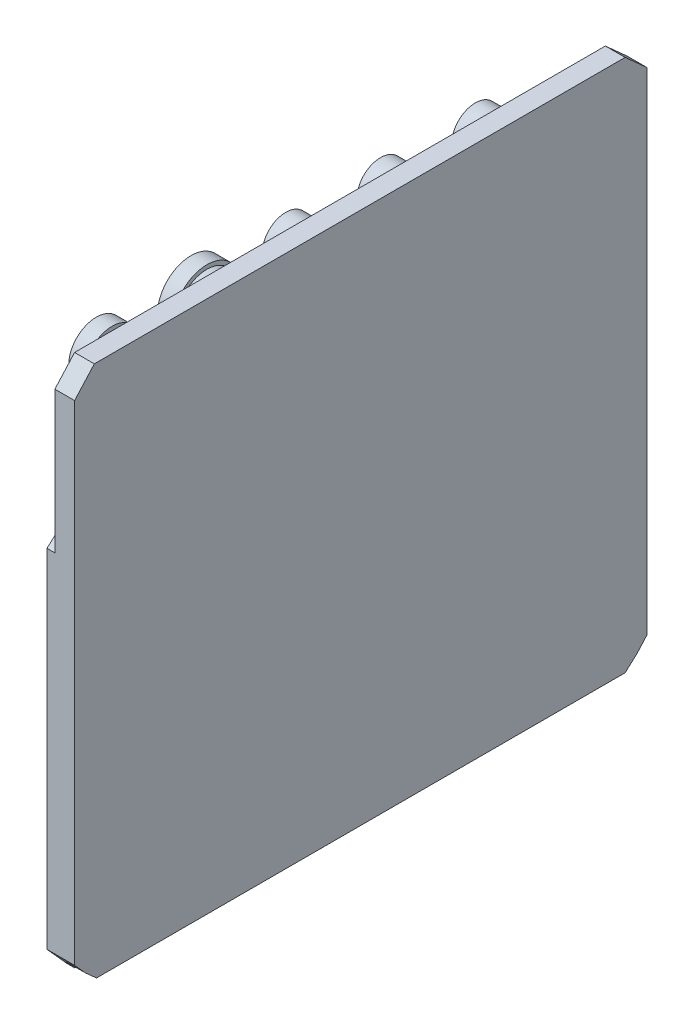
ISO-10303-21;
HEADER;
FILE_DESCRIPTION(('STEP AP214'),'2;1');
FILE_NAME('part.step','',(''),(''),'','','');
FILE_SCHEMA(('AUTOMOTIVE_DESIGN { 1 0 10303 214 1 1 1 1 }'));
ENDSEC;
DATA;
#1=APPLICATION_CONTEXT('core data for automotive mechanical design processes');
#2=APPLICATION_PROTOCOL_DEFINITION('international standard','automotive_design',2000,#1);
#3=PRODUCT_CONTEXT('',#1,'mechanical');
#4=PRODUCT('Part','Part','',(#3));
#5=PRODUCT_RELATED_PRODUCT_CATEGORY('part','',(#4));
#6=PRODUCT_DEFINITION_FORMATION('','',#4);
#7=PRODUCT_DEFINITION_CONTEXT('part definition',#1,'design');
#8=PRODUCT_DEFINITION('design','',#6,#7);
#9=PRODUCT_DEFINITION_SHAPE('','',#8);
#10=(LENGTH_UNIT() NAMED_UNIT(*) SI_UNIT(.MILLI.,.METRE.));
#11=(NAMED_UNIT(*) PLANE_ANGLE_UNIT() SI_UNIT($,.RADIAN.));
#12=(NAMED_UNIT(*) SI_UNIT($,.STERADIAN.) SOLID_ANGLE_UNIT());
#13=UNCERTAINTY_MEASURE_WITH_UNIT(LENGTH_MEASURE(1.E-05),#10,'distance_accuracy_value','');
#14=(GEOMETRIC_REPRESENTATION_CONTEXT(3) GLOBAL_UNCERTAINTY_ASSIGNED_CONTEXT((#13)) GLOBAL_UNIT_ASSIGNED_CONTEXT((#10,
#11,#12)) REPRESENTATION_CONTEXT('',''));
#15=CARTESIAN_POINT('',(0.,0.,0.));
#16=DIRECTION('',(0.,0.,1.));
#17=DIRECTION('',(1.,0.,0.));
#18=AXIS2_PLACEMENT_3D('',#15,#16,#17);
#19=CARTESIAN_POINT('',(0.,135.,0.));
#20=DIRECTION('',(-1.,0.,0.));
#21=DIRECTION('',(0.,0.,1.));
#22=AXIS2_PLACEMENT_3D('',#19,#20,#21);
#23=PLANE('',#22);
#24=CARTESIAN_POINT('',(0.,119.,-48.5));
#25=DIRECTION('',(-1.,0.,0.));
#26=DIRECTION('',(0.,0.,1.));
#27=AXIS2_PLACEMENT_3D('',#24,#25,#26);
#28=CIRCLE('',#27,7.5);
#29=CARTESIAN_POINT('',(0.,119.,-41.));
#30=VERTEX_POINT('',#29);
#31=EDGE_CURVE('E812',#30,#30,#28,.T.);
#32=ORIENTED_EDGE('',*,*,#31,.F.);
#33=EDGE_LOOP('',(#32));
#34=FACE_BOUND('',#33,.T.);
#35=CARTESIAN_POINT('',(0.,119.003353079087,-96.5));
#36=DIRECTION('',(-1.,0.,0.));
#37=DIRECTION('',(0.,0.,1.));
#38=AXIS2_PLACEMENT_3D('',#35,#36,#37);
#39=CIRCLE('',#38,5.00000000000001);
#40=CARTESIAN_POINT('',(0.,119.003353079087,-91.5));
#41=VERTEX_POINT('',#40);
#42=EDGE_CURVE('E824',#41,#41,#39,.T.);
#43=ORIENTED_EDGE('',*,*,#42,.F.);
#44=EDGE_LOOP('',(#43));
#45=FACE_BOUND('',#44,.T.);
#46=DIRECTION('',(0.,0.,-1.));
#47=VECTOR('',#46,1.);
#48=CARTESIAN_POINT('',(0.,98.5428750887542,-145.));
#49=LINE('',#48,#47);
#50=CARTESIAN_POINT('',(0.,98.5428750887542,-5.55306257414598));
#51=VERTEX_POINT('',#50);
#52=CARTESIAN_POINT('',(0.,98.5428750887542,-140.));
#53=VERTEX_POINT('',#52);
#54=EDGE_CURVE('E176',#51,#53,#49,.T.);
#55=ORIENTED_EDGE('',*,*,#54,.F.);
#56=DIRECTION('',(0.,0.66913060635886,-0.743144825477393));
#57=VECTOR('',#56,1.);
#58=CARTESIAN_POINT('',(0.,98.5428750887542,-5.55306257414598));
#59=LINE('',#58,#57);
#60=CARTESIAN_POINT('',(0.,93.5428750887541,0.));
#61=VERTEX_POINT('',#60);
#62=EDGE_CURVE('E55',#51,#61,#59,.F.);
#63=ORIENTED_EDGE('',*,*,#62,.T.);
#64=DIRECTION('',(0.,-1.,0.));
#65=VECTOR('',#64,1.);
#66=CARTESIAN_POINT('',(0.,0.,0.));
#67=LINE('',#66,#65);
#68=CARTESIAN_POINT('',(0.,129.446937425854,0.));
#69=VERTEX_POINT('',#68);
#70=EDGE_CURVE('E936',#69,#61,#67,.T.);
#71=ORIENTED_EDGE('',*,*,#70,.F.);
#72=DIRECTION('',(0.,-0.743144825477391,0.669130606358862));
#73=VECTOR('',#72,1.);
#74=CARTESIAN_POINT('',(0.,132.513695261579,-2.76132115816913));
#75=LINE('',#74,#73);
#76=CARTESIAN_POINT('',(0.,135.,-5.00000000000003));
#77=VERTEX_POINT('',#76);
#78=EDGE_CURVE('E171',#69,#77,#75,.F.);
#79=ORIENTED_EDGE('',*,*,#78,.T.);
#80=DIRECTION('',(0.,0.,1.));
#81=VECTOR('',#80,1.);
#82=CARTESIAN_POINT('',(0.,135.,0.));
#83=LINE('',#82,#81);
#84=CARTESIAN_POINT('',(0.,135.,-139.446937425854));
#85=VERTEX_POINT('',#84);
#86=EDGE_CURVE('E888',#85,#77,#83,.T.);
#87=ORIENTED_EDGE('',*,*,#86,.F.);
#88=DIRECTION('',(0.,0.669130606358862,0.743144825477391));
#89=VECTOR('',#88,1.);
#90=CARTESIAN_POINT('',(0.,204.341516256031,-62.4353816746751));
#91=LINE('',#90,#89);
#92=CARTESIAN_POINT('',(0.,130.,-145.));
#93=VERTEX_POINT('',#92);
#94=EDGE_CURVE('E900',#85,#93,#91,.F.);
#95=ORIENTED_EDGE('',*,*,#94,.T.);
#96=DIRECTION('',(0.,1.,0.));
#97=VECTOR('',#96,1.);
#98=CARTESIAN_POINT('',(0.,0.,-145.));
#99=LINE('',#98,#97);
#100=CARTESIAN_POINT('',(0.,92.9898125146082,-145.));
#101=VERTEX_POINT('',#100);
#102=EDGE_CURVE('E893',#101,#93,#99,.T.);
#103=ORIENTED_EDGE('',*,*,#102,.F.);
#104=DIRECTION('',(0.,-0.743144825477395,-0.669130606358858));
#105=VECTOR('',#104,1.);
#106=CARTESIAN_POINT('',(0.,92.9898125146082,-145.));
#107=LINE('',#106,#105);
#108=EDGE_CURVE('E47',#101,#53,#107,.F.);
#109=ORIENTED_EDGE('',*,*,#108,.T.);
#110=EDGE_LOOP('',(#55,#63,#71,#79,#87,#95,#103,#109));
#111=FACE_BOUND('',#110,.T.);
#112=CARTESIAN_POINT('',(0.,119.,-120.5));
#113=DIRECTION('',(-1.,0.,0.));
#114=DIRECTION('',(0.,0.,1.));
#115=AXIS2_PLACEMENT_3D('',#112,#113,#114);
#116=CIRCLE('',#115,5.00000000000001);
#117=CARTESIAN_POINT('',(0.,119.,-115.5));
#118=VERTEX_POINT('',#117);
#119=EDGE_CURVE('E830',#118,#118,#116,.T.);
#120=ORIENTED_EDGE('',*,*,#119,.F.);
#121=EDGE_LOOP('',(#120));
#122=FACE_BOUND('',#121,.T.);
#123=CARTESIAN_POINT('',(0.,119.,-72.5));
#124=DIRECTION('',(-1.,0.,0.));
#125=DIRECTION('',(0.,0.,1.));
#126=AXIS2_PLACEMENT_3D('',#123,#124,#125);
#127=CIRCLE('',#126,5.00000000000001);
#128=CARTESIAN_POINT('',(0.,119.,-67.5));
#129=VERTEX_POINT('',#128);
#130=EDGE_CURVE('E818',#129,#129,#127,.T.);
#131=ORIENTED_EDGE('',*,*,#130,.F.);
#132=EDGE_LOOP('',(#131));
#133=FACE_BOUND('',#132,.T.);
#134=CARTESIAN_POINT('',(0.,119.003353079087,-24.5));
#135=DIRECTION('',(-1.,0.,0.));
#136=DIRECTION('',(0.,0.,1.));
#137=AXIS2_PLACEMENT_3D('',#134,#135,#136);
#138=CIRCLE('',#137,6.);
#139=CARTESIAN_POINT('',(0.,119.003353079087,-18.5));
#140=VERTEX_POINT('',#139);
#141=EDGE_CURVE('E806',#140,#140,#138,.T.);
#142=ORIENTED_EDGE('',*,*,#141,.F.);
#143=EDGE_LOOP('',(#142));
#144=FACE_BOUND('',#143,.T.);
#145=ADVANCED_FACE('F32',(#34,#45,#111,#122,#133,#144),#23,.T.);
#146=CARTESIAN_POINT('',(5.,0.,0.));
#147=DIRECTION('',(0.,0.,-1.));
#148=DIRECTION('',(-1.,0.,0.));
#149=AXIS2_PLACEMENT_3D('',#146,#147,#148);
#150=PLANE('',#149);
#151=DIRECTION('',(0.,1.,0.));
#152=VECTOR('',#151,1.);
#153=CARTESIAN_POINT('',(-2.,98.5428750887542,0.));
#154=LINE('',#153,#152);
#155=CARTESIAN_POINT('',(-2.,5.55306257414596,0.));
#156=VERTEX_POINT('',#155);
#157=CARTESIAN_POINT('',(-2.,93.5428750887541,0.));
#158=VERTEX_POINT('',#157);
#159=EDGE_CURVE('E882',#156,#158,#154,.T.);
#160=ORIENTED_EDGE('',*,*,#159,.F.);
#161=DIRECTION('',(1.,0.,0.));
#162=VECTOR('',#161,1.);
#163=CARTESIAN_POINT('',(5.,5.55306257414598,0.));
#164=LINE('',#163,#162);
#165=CARTESIAN_POINT('',(5.,5.55306257414598,0.));
#166=VERTEX_POINT('',#165);
#167=EDGE_CURVE('E872',#156,#166,#164,.T.);
#168=ORIENTED_EDGE('',*,*,#167,.T.);
#169=DIRECTION('',(0.,-1.,0.));
#170=VECTOR('',#169,1.);
#171=CARTESIAN_POINT('',(5.,0.,0.));
#172=LINE('',#171,#170);
#173=CARTESIAN_POINT('',(5.,129.446937425854,0.));
#174=VERTEX_POINT('',#173);
#175=EDGE_CURVE('E879',#174,#166,#172,.T.);
#176=ORIENTED_EDGE('',*,*,#175,.F.);
#177=DIRECTION('',(-1.,0.,0.));
#178=VECTOR('',#177,1.);
#179=CARTESIAN_POINT('',(5.,129.446937425854,0.));
#180=LINE('',#179,#178);
#181=EDGE_CURVE('E158',#174,#69,#180,.T.);
#182=ORIENTED_EDGE('',*,*,#181,.T.);
#183=ORIENTED_EDGE('',*,*,#70,.T.);
#184=DIRECTION('',(-1.,0.,0.));
#185=VECTOR('',#184,1.);
#186=CARTESIAN_POINT('',(5.,93.5428750887541,0.));
#187=LINE('',#186,#185);
#188=EDGE_CURVE('E870',#61,#158,#187,.T.);
#189=ORIENTED_EDGE('',*,*,#188,.T.);
#190=EDGE_LOOP('',(#160,#168,#176,#182,#183,#189));
#191=FACE_BOUND('',#190,.T.);
#192=ADVANCED_FACE('F34',(#191),#150,.F.);
#193=CARTESIAN_POINT('',(5.,0.,0.));
#194=DIRECTION('',(0.,1.,0.));
#195=DIRECTION('',(0.,0.,1.));
#196=AXIS2_PLACEMENT_3D('',#193,#194,#195);
#197=PLANE('',#196);
#198=DIRECTION('',(0.,0.,1.));
#199=VECTOR('',#198,1.);
#200=CARTESIAN_POINT('',(-2.,0.,-145.));
#201=LINE('',#200,#199);
#202=CARTESIAN_POINT('',(-2.,0.,-139.446937425854));
#203=VERTEX_POINT('',#202);
#204=CARTESIAN_POINT('',(-2.,0.,-5.00000000000003));
#205=VERTEX_POINT('',#204);
#206=EDGE_CURVE('E932',#203,#205,#201,.T.);
#207=ORIENTED_EDGE('',*,*,#206,.F.);
#208=DIRECTION('',(1.,0.,0.));
#209=VECTOR('',#208,1.);
#210=CARTESIAN_POINT('',(5.,0.,-139.446937425854));
#211=LINE('',#210,#209);
#212=CARTESIAN_POINT('',(5.,0.,-139.446937425854));
#213=VERTEX_POINT('',#212);
#214=EDGE_CURVE('E921',#203,#213,#211,.T.);
#215=ORIENTED_EDGE('',*,*,#214,.T.);
#216=DIRECTION('',(0.,0.,-1.));
#217=VECTOR('',#216,1.);
#218=CARTESIAN_POINT('',(5.,0.,0.));
#219=LINE('',#218,#217);
#220=CARTESIAN_POINT('',(5.,0.,-5.55306257414598));
#221=VERTEX_POINT('',#220);
#222=EDGE_CURVE('E170',#221,#213,#219,.T.);
#223=ORIENTED_EDGE('',*,*,#222,.F.);
#224=DIRECTION('',(-1.,0.,0.));
#225=VECTOR('',#224,1.);
#226=CARTESIAN_POINT('',(5.,0.,-5.55306257414598));
#227=LINE('',#226,#225);
#228=CARTESIAN_POINT('',(0.,0.,-5.55306257414597));
#229=VERTEX_POINT('',#228);
#230=EDGE_CURVE('E152',#221,#229,#227,.T.);
#231=ORIENTED_EDGE('',*,*,#230,.T.);
#232=DIRECTION('',(0.,0.,1.));
#233=VECTOR('',#232,1.);
#234=CARTESIAN_POINT('',(0.,0.,-145.));
#235=LINE('',#234,#233);
#236=CARTESIAN_POINT('',(0.,0.,-5.00000000000003));
#237=VERTEX_POINT('',#236);
#238=EDGE_CURVE('E166',#229,#237,#235,.T.);
#239=ORIENTED_EDGE('',*,*,#238,.T.);
#240=DIRECTION('',(-1.,0.,0.));
#241=VECTOR('',#240,1.);
#242=CARTESIAN_POINT('',(5.,0.,-5.00000000000003));
#243=LINE('',#242,#241);
#244=EDGE_CURVE('E919',#237,#205,#243,.T.);
#245=ORIENTED_EDGE('',*,*,#244,.T.);
#246=EDGE_LOOP('',(#207,#215,#223,#231,#239,#245));
#247=FACE_BOUND('',#246,.T.);
#248=ADVANCED_FACE('F165',(#247),#197,.F.);
#249=CARTESIAN_POINT('',(5.,0.,-145.));
#250=DIRECTION('',(0.,0.,1.));
#251=DIRECTION('',(1.,0.,0.));
#252=AXIS2_PLACEMENT_3D('',#249,#250,#251);
#253=PLANE('',#252);
#254=DIRECTION('',(0.,-1.,0.));
#255=VECTOR('',#254,1.);
#256=CARTESIAN_POINT('',(0.,98.5428750887542,-145.));
#257=LINE('',#256,#255);
#258=CARTESIAN_POINT('',(0.,5.553062574146,-145.));
#259=VERTEX_POINT('',#258);
#260=CARTESIAN_POINT('',(0.,5.00000000000009,-145.));
#261=VERTEX_POINT('',#260);
#262=EDGE_CURVE('E177',#259,#261,#257,.T.);
#263=ORIENTED_EDGE('',*,*,#262,.T.);
#264=DIRECTION('',(-1.,0.,0.));
#265=VECTOR('',#264,1.);
#266=CARTESIAN_POINT('',(5.,5.00000000000006,-145.));
#267=LINE('',#266,#265);
#268=CARTESIAN_POINT('',(-2.,5.00000000000004,-145.));
#269=VERTEX_POINT('',#268);
#270=EDGE_CURVE('E860',#261,#269,#267,.T.);
#271=ORIENTED_EDGE('',*,*,#270,.T.);
#272=DIRECTION('',(0.,-1.,0.));
#273=VECTOR('',#272,1.);
#274=CARTESIAN_POINT('',(-2.,98.5428750887542,-145.));
#275=LINE('',#274,#273);
#276=CARTESIAN_POINT('',(-2.,92.9898125146082,-145.));
#277=VERTEX_POINT('',#276);
#278=EDGE_CURVE('E179',#277,#269,#275,.T.);
#279=ORIENTED_EDGE('',*,*,#278,.F.);
#280=DIRECTION('',(1.,0.,0.));
#281=VECTOR('',#280,1.);
#282=CARTESIAN_POINT('',(5.,92.9898125146082,-145.));
#283=LINE('',#282,#281);
#284=EDGE_CURVE('E856',#277,#101,#283,.T.);
#285=ORIENTED_EDGE('',*,*,#284,.T.);
#286=ORIENTED_EDGE('',*,*,#102,.T.);
#287=DIRECTION('',(1.,0.,0.));
#288=VECTOR('',#287,1.);
#289=CARTESIAN_POINT('',(5.,130.,-145.));
#290=LINE('',#289,#288);
#291=CARTESIAN_POINT('',(5.,130.,-145.));
#292=VERTEX_POINT('',#291);
#293=EDGE_CURVE('E916',#93,#292,#290,.T.);
#294=ORIENTED_EDGE('',*,*,#293,.T.);
#295=DIRECTION('',(0.,1.,0.));
#296=VECTOR('',#295,1.);
#297=CARTESIAN_POINT('',(5.,0.,-145.));
#298=LINE('',#297,#296);
#299=CARTESIAN_POINT('',(5.,5.55306257414598,-145.));
#300=VERTEX_POINT('',#299);
#301=EDGE_CURVE('E890',#300,#292,#298,.T.);
#302=ORIENTED_EDGE('',*,*,#301,.F.);
#303=DIRECTION('',(-1.,0.,0.));
#304=VECTOR('',#303,1.);
#305=CARTESIAN_POINT('',(5.,5.55306257414598,-145.));
#306=LINE('',#305,#304);
#307=EDGE_CURVE('E912',#300,#259,#306,.T.);
#308=ORIENTED_EDGE('',*,*,#307,.T.);
#309=EDGE_LOOP('',(#263,#271,#279,#285,#286,#294,#302,#308));
#310=FACE_BOUND('',#309,.T.);
#311=ADVANCED_FACE('F254',(#310),#253,.F.);
#312=CARTESIAN_POINT('',(5.,135.,0.));
#313=DIRECTION('',(0.,-1.,0.));
#314=DIRECTION('',(0.,0.,-1.));
#315=AXIS2_PLACEMENT_3D('',#312,#313,#314);
#316=PLANE('',#315);
#317=DIRECTION('',(0.,0.,1.));
#318=VECTOR('',#317,1.);
#319=CARTESIAN_POINT('',(5.,135.,0.));
#320=LINE('',#319,#318);
#321=CARTESIAN_POINT('',(5.,135.,-139.446937425854));
#322=VERTEX_POINT('',#321);
#323=CARTESIAN_POINT('',(5.,135.,-5.00000000000003));
#324=VERTEX_POINT('',#323);
#325=EDGE_CURVE('E172',#322,#324,#320,.T.);
#326=ORIENTED_EDGE('',*,*,#325,.F.);
#327=DIRECTION('',(-1.,0.,0.));
#328=VECTOR('',#327,1.);
#329=CARTESIAN_POINT('',(5.,135.,-139.446937425854));
#330=LINE('',#329,#328);
#331=EDGE_CURVE('E922',#322,#85,#330,.T.);
#332=ORIENTED_EDGE('',*,*,#331,.T.);
#333=ORIENTED_EDGE('',*,*,#86,.T.);
#334=DIRECTION('',(1.,0.,0.));
#335=VECTOR('',#334,1.);
#336=CARTESIAN_POINT('',(5.,135.,-5.00000000000003));
#337=LINE('',#336,#335);
#338=EDGE_CURVE('E915',#77,#324,#337,.T.);
#339=ORIENTED_EDGE('',*,*,#338,.T.);
#340=EDGE_LOOP('',(#326,#332,#333,#339));
#341=FACE_BOUND('',#340,.T.);
#342=ADVANCED_FACE('F250',(#341),#316,.F.);
#343=CARTESIAN_POINT('',(5.,135.,0.));
#344=DIRECTION('',(-1.,0.,0.));
#345=DIRECTION('',(0.,0.,1.));
#346=AXIS2_PLACEMENT_3D('',#343,#344,#345);
#347=PLANE('',#346);
#348=ORIENTED_EDGE('',*,*,#222,.T.);
#349=DIRECTION('',(0.,-0.669130606358864,0.743144825477389));
#350=VECTOR('',#349,1.);
#351=CARTESIAN_POINT('',(5.,0.,-139.446937425854));
#352=LINE('',#351,#350);
#353=CARTESIAN_POINT('',(5.,2.63101944820765,-142.368980551792));
#354=VERTEX_POINT('',#353);
#355=EDGE_CURVE('E925',#213,#354,#352,.F.);
#356=ORIENTED_EDGE('',*,*,#355,.T.);
#357=DIRECTION('',(0.,-0.743144825477395,0.669130606358858));
#358=VECTOR('',#357,1.);
#359=CARTESIAN_POINT('',(5.,5.55306257414598,-145.));
#360=LINE('',#359,#358);
#361=EDGE_CURVE('E947',#354,#300,#360,.F.);
#362=ORIENTED_EDGE('',*,*,#361,.T.);
#363=ORIENTED_EDGE('',*,*,#301,.T.);
#364=DIRECTION('',(0.,-0.669130606358862,-0.743144825477391));
#365=VECTOR('',#364,1.);
#366=CARTESIAN_POINT('',(5.,135.,-139.446937425854));
#367=LINE('',#366,#365);
#368=EDGE_CURVE('E949',#292,#322,#367,.F.);
#369=ORIENTED_EDGE('',*,*,#368,.T.);
#370=ORIENTED_EDGE('',*,*,#325,.T.);
#371=DIRECTION('',(0.,0.743144825477391,-0.669130606358862));
#372=VECTOR('',#371,1.);
#373=CARTESIAN_POINT('',(5.,129.446937425854,0.));
#374=LINE('',#373,#372);
#375=EDGE_CURVE('E887',#324,#174,#374,.F.);
#376=ORIENTED_EDGE('',*,*,#375,.T.);
#377=ORIENTED_EDGE('',*,*,#175,.T.);
#378=DIRECTION('',(0.,0.743144825477393,0.66913060635886));
#379=VECTOR('',#378,1.);
#380=CARTESIAN_POINT('',(5.,5.55306257414598,0.));
#381=LINE('',#380,#379);
#382=CARTESIAN_POINT('',(5.,2.63101944820752,-2.6310194482077));
#383=VERTEX_POINT('',#382);
#384=EDGE_CURVE('E884',#166,#383,#381,.F.);
#385=ORIENTED_EDGE('',*,*,#384,.T.);
#386=DIRECTION('',(0.,0.669130606358858,0.743144825477395));
#387=VECTOR('',#386,1.);
#388=CARTESIAN_POINT('',(5.,0.,-5.55306257414598));
#389=LINE('',#388,#387);
#390=EDGE_CURVE('E945',#383,#221,#389,.F.);
#391=ORIENTED_EDGE('',*,*,#390,.T.);
#392=EDGE_LOOP('',(#348,#356,#362,#363,#369,#370,#376,#377,#385,#391));
#393=FACE_BOUND('',#392,.T.);
#394=ADVANCED_FACE('F247',(#393),#347,.F.);
#395=CARTESIAN_POINT('',(5.,0.,-5.55306257414598));
#396=DIRECTION('',(0.,0.743144825477395,-0.669130606358858));
#397=DIRECTION('',(0.,0.669130606358858,0.743144825477395));
#398=AXIS2_PLACEMENT_3D('',#395,#396,#397);
#399=PLANE('',#398);
#400=ORIENTED_EDGE('',*,*,#390,.F.);
#401=DIRECTION('',(-1.,0.,0.));
#402=VECTOR('',#401,1.);
#403=CARTESIAN_POINT('',(5.,2.63101944820754,-2.63101944820769));
#404=LINE('',#403,#402);
#405=CARTESIAN_POINT('',(0.,2.63101944820713,-2.63101944820809));
#406=VERTEX_POINT('',#405);
#407=EDGE_CURVE('E154',#383,#406,#404,.T.);
#408=ORIENTED_EDGE('',*,*,#407,.T.);
#409=DIRECTION('',(0.,-0.669130606358858,-0.743144825477395));
#410=VECTOR('',#409,1.);
#411=CARTESIAN_POINT('',(0.,63.2056498876024,64.6439231989378));
#412=LINE('',#411,#410);
#413=EDGE_CURVE('E148',#229,#406,#412,.F.);
#414=ORIENTED_EDGE('',*,*,#413,.F.);
#415=ORIENTED_EDGE('',*,*,#230,.F.);
#416=EDGE_LOOP('',(#400,#408,#414,#415));
#417=FACE_BOUND('',#416,.T.);
#418=ADVANCED_FACE('F151',(#417),#399,.F.);
#419=CARTESIAN_POINT('',(5.,5.55306257414598,-145.));
#420=DIRECTION('',(0.,0.669130606358858,0.743144825477395));
#421=DIRECTION('',(0.,-0.743144825477395,0.669130606358858));
#422=AXIS2_PLACEMENT_3D('',#419,#420,#421);
#423=PLANE('',#422);
#424=ORIENTED_EDGE('',*,*,#361,.F.);
#425=DIRECTION('',(-1.,0.,0.));
#426=VECTOR('',#425,1.);
#427=CARTESIAN_POINT('',(5.,2.63101944820769,-142.368980551792));
#428=LINE('',#427,#426);
#429=CARTESIAN_POINT('',(0.,2.63101944820759,-142.368980551792));
#430=VERTEX_POINT('',#429);
#431=EDGE_CURVE('E927',#354,#430,#428,.T.);
#432=ORIENTED_EDGE('',*,*,#431,.T.);
#433=DIRECTION('',(0.,0.743144825477395,-0.669130606358858));
#434=VECTOR('',#433,1.);
#435=CARTESIAN_POINT('',(0.,4.93913859478762,-144.447220366094));
#436=LINE('',#435,#434);
#437=EDGE_CURVE('E159',#259,#430,#436,.F.);
#438=ORIENTED_EDGE('',*,*,#437,.F.);
#439=ORIENTED_EDGE('',*,*,#307,.F.);
#440=EDGE_LOOP('',(#424,#432,#438,#439));
#441=FACE_BOUND('',#440,.T.);
#442=ADVANCED_FACE('F282',(#441),#423,.F.);
#443=CARTESIAN_POINT('',(5.,135.,-139.446937425854));
#444=DIRECTION('',(0.,-0.743144825477391,0.669130606358862));
#445=DIRECTION('',(0.,-0.669130606358862,-0.743144825477391));
#446=AXIS2_PLACEMENT_3D('',#443,#444,#445);
#447=PLANE('',#446);
#448=ORIENTED_EDGE('',*,*,#368,.F.);
#449=ORIENTED_EDGE('',*,*,#293,.F.);
#450=ORIENTED_EDGE('',*,*,#94,.F.);
#451=ORIENTED_EDGE('',*,*,#331,.F.);
#452=EDGE_LOOP('',(#448,#449,#450,#451));
#453=FACE_BOUND('',#452,.T.);
#454=ADVANCED_FACE('F288',(#453),#447,.F.);
#455=CARTESIAN_POINT('',(5.,129.446937425854,0.));
#456=DIRECTION('',(0.,-0.669130606358861,-0.743144825477391));
#457=DIRECTION('',(0.,0.743144825477391,-0.669130606358862));
#458=AXIS2_PLACEMENT_3D('',#455,#456,#457);
#459=PLANE('',#458);
#460=ORIENTED_EDGE('',*,*,#375,.F.);
#461=ORIENTED_EDGE('',*,*,#338,.F.);
#462=ORIENTED_EDGE('',*,*,#78,.F.);
#463=ORIENTED_EDGE('',*,*,#181,.F.);
#464=EDGE_LOOP('',(#460,#461,#462,#463));
#465=FACE_BOUND('',#464,.T.);
#466=ADVANCED_FACE('F295',(#465),#459,.F.);
#467=CARTESIAN_POINT('',(0.,0.,-145.));
#468=DIRECTION('',(-1.,0.,0.));
#469=DIRECTION('',(0.,0.,1.));
#470=AXIS2_PLACEMENT_3D('',#467,#468,#469);
#471=PLANE('',#470);
#472=ORIENTED_EDGE('',*,*,#413,.T.);
#473=DIRECTION('',(0.,0.743144825477393,0.66913060635886));
#474=VECTOR('',#473,1.);
#475=CARTESIAN_POINT('',(0.,5.55306257414598,0.));
#476=LINE('',#475,#474);
#477=EDGE_CURVE('E175',#406,#237,#476,.F.);
#478=ORIENTED_EDGE('',*,*,#477,.T.);
#479=ORIENTED_EDGE('',*,*,#238,.F.);
#480=EDGE_LOOP('',(#472,#478,#479));
#481=FACE_BOUND('',#480,.T.);
#482=ADVANCED_FACE('F174',(#481),#471,.F.);
#483=ORIENTED_EDGE('',*,*,#437,.T.);
#484=DIRECTION('',(0.,-0.669130606358864,0.743144825477389));
#485=VECTOR('',#484,1.);
#486=CARTESIAN_POINT('',(0.,0.,-139.446937425854));
#487=LINE('',#486,#485);
#488=EDGE_CURVE('E929',#430,#261,#487,.F.);
#489=ORIENTED_EDGE('',*,*,#488,.T.);
#490=ORIENTED_EDGE('',*,*,#262,.F.);
#491=EDGE_LOOP('',(#483,#489,#490));
#492=FACE_BOUND('',#491,.T.);
#493=ADVANCED_FACE('F309',(#492),#471,.F.);
#494=CARTESIAN_POINT('',(-2.,98.5428750887542,-145.));
#495=DIRECTION('',(0.,-1.,0.));
#496=DIRECTION('',(0.,0.,-1.));
#497=AXIS2_PLACEMENT_3D('',#494,#495,#496);
#498=PLANE('',#497);
#499=DIRECTION('',(0.,0.,-1.));
#500=VECTOR('',#499,1.);
#501=CARTESIAN_POINT('',(-2.,98.5428750887542,-145.));
#502=LINE('',#501,#500);
#503=CARTESIAN_POINT('',(-2.,98.5428750887542,-5.553062574146));
#504=VERTEX_POINT('',#503);
#505=CARTESIAN_POINT('',(-2.,98.5428750887542,-140.));
#506=VERTEX_POINT('',#505);
#507=EDGE_CURVE('E934',#504,#506,#502,.T.);
#508=ORIENTED_EDGE('',*,*,#507,.F.);
#509=DIRECTION('',(1.,0.,0.));
#510=VECTOR('',#509,1.);
#511=CARTESIAN_POINT('',(-2.,98.5428750887542,-5.55306257414598));
#512=LINE('',#511,#510);
#513=EDGE_CURVE('E202',#504,#51,#512,.T.);
#514=ORIENTED_EDGE('',*,*,#513,.T.);
#515=ORIENTED_EDGE('',*,*,#54,.T.);
#516=DIRECTION('',(-1.,0.,0.));
#517=VECTOR('',#516,1.);
#518=CARTESIAN_POINT('',(-2.,98.5428750887542,-140.));
#519=LINE('',#518,#517);
#520=EDGE_CURVE('E200',#53,#506,#519,.T.);
#521=ORIENTED_EDGE('',*,*,#520,.T.);
#522=EDGE_LOOP('',(#508,#514,#515,#521));
#523=FACE_BOUND('',#522,.T.);
#524=ADVANCED_FACE('F316',(#523),#498,.F.);
#525=CARTESIAN_POINT('',(-2.,0.,-145.));
#526=DIRECTION('',(-1.,0.,0.));
#527=DIRECTION('',(0.,0.,1.));
#528=AXIS2_PLACEMENT_3D('',#525,#526,#527);
#529=PLANE('',#528);
#530=ORIENTED_EDGE('',*,*,#278,.T.);
#531=DIRECTION('',(0.,0.669130606358864,-0.743144825477389));
#532=VECTOR('',#531,1.);
#533=CARTESIAN_POINT('',(-2.,2.76132115816913,-142.513695261579));
#534=LINE('',#533,#532);
#535=EDGE_CURVE('E868',#269,#203,#534,.F.);
#536=ORIENTED_EDGE('',*,*,#535,.T.);
#537=ORIENTED_EDGE('',*,*,#206,.T.);
#538=DIRECTION('',(0.,-0.743144825477393,-0.66913060635886));
#539=VECTOR('',#538,1.);
#540=CARTESIAN_POINT('',(-2.,-69.6165326757792,-67.6830075712645));
#541=LINE('',#540,#539);
#542=EDGE_CURVE('E862',#205,#156,#541,.F.);
#543=ORIENTED_EDGE('',*,*,#542,.T.);
#544=ORIENTED_EDGE('',*,*,#159,.T.);
#545=DIRECTION('',(0.,-0.66913060635886,0.743144825477393));
#546=VECTOR('',#545,1.);
#547=CARTESIAN_POINT('',(-2.,123.763221449909,-33.5630948711719));
#548=LINE('',#547,#546);
#549=EDGE_CURVE('E859',#158,#504,#548,.F.);
#550=ORIENTED_EDGE('',*,*,#549,.T.);
#551=ORIENTED_EDGE('',*,*,#507,.T.);
#552=DIRECTION('',(0.,0.743144825477395,0.669130606358858));
#553=VECTOR('',#552,1.);
#554=CARTESIAN_POINT('',(-2.,41.6348651564544,-191.240202295984));
#555=LINE('',#554,#553);
#556=EDGE_CURVE('E855',#506,#277,#555,.F.);
#557=ORIENTED_EDGE('',*,*,#556,.T.);
#558=EDGE_LOOP('',(#530,#536,#537,#543,#544,#550,#551,#557));
#559=FACE_BOUND('',#558,.T.);
#560=ADVANCED_FACE('F323',(#559),#529,.T.);
#561=CARTESIAN_POINT('',(5.,0.,-139.446937425854));
#562=DIRECTION('',(0.,0.743144825477389,0.669130606358863));
#563=DIRECTION('',(0.,-0.669130606358864,0.743144825477389));
#564=AXIS2_PLACEMENT_3D('',#561,#562,#563);
#565=PLANE('',#564);
#566=ORIENTED_EDGE('',*,*,#535,.F.);
#567=ORIENTED_EDGE('',*,*,#270,.F.);
#568=ORIENTED_EDGE('',*,*,#488,.F.);
#569=ORIENTED_EDGE('',*,*,#431,.F.);
#570=ORIENTED_EDGE('',*,*,#355,.F.);
#571=ORIENTED_EDGE('',*,*,#214,.F.);
#572=EDGE_LOOP('',(#566,#567,#568,#569,#570,#571));
#573=FACE_BOUND('',#572,.T.);
#574=ADVANCED_FACE('F331',(#573),#565,.F.);
#575=CARTESIAN_POINT('',(5.,5.55306257414598,0.));
#576=DIRECTION('',(0.,0.66913060635886,-0.743144825477393));
#577=DIRECTION('',(0.,0.743144825477393,0.66913060635886));
#578=AXIS2_PLACEMENT_3D('',#575,#576,#577);
#579=PLANE('',#578);
#580=ORIENTED_EDGE('',*,*,#542,.F.);
#581=ORIENTED_EDGE('',*,*,#244,.F.);
#582=ORIENTED_EDGE('',*,*,#477,.F.);
#583=ORIENTED_EDGE('',*,*,#407,.F.);
#584=ORIENTED_EDGE('',*,*,#384,.F.);
#585=ORIENTED_EDGE('',*,*,#167,.F.);
#586=EDGE_LOOP('',(#580,#581,#582,#583,#584,#585));
#587=FACE_BOUND('',#586,.T.);
#588=ADVANCED_FACE('F339',(#587),#579,.F.);
#589=CARTESIAN_POINT('',(-2.,98.5428750887542,-5.55306257414598));
#590=DIRECTION('',(0.,-0.743144825477393,-0.66913060635886));
#591=DIRECTION('',(0.,0.66913060635886,-0.743144825477393));
#592=AXIS2_PLACEMENT_3D('',#589,#590,#591);
#593=PLANE('',#592);
#594=ORIENTED_EDGE('',*,*,#549,.F.);
#595=ORIENTED_EDGE('',*,*,#188,.F.);
#596=ORIENTED_EDGE('',*,*,#62,.F.);
#597=ORIENTED_EDGE('',*,*,#513,.F.);
#598=EDGE_LOOP('',(#594,#595,#596,#597));
#599=FACE_BOUND('',#598,.T.);
#600=ADVANCED_FACE('F347',(#599),#593,.F.);
#601=CARTESIAN_POINT('',(5.,92.9898125146082,-145.));
#602=DIRECTION('',(0.,-0.669130606358858,0.743144825477395));
#603=DIRECTION('',(0.,-0.743144825477395,-0.669130606358858));
#604=AXIS2_PLACEMENT_3D('',#601,#602,#603);
#605=PLANE('',#604);
#606=ORIENTED_EDGE('',*,*,#556,.F.);
#607=ORIENTED_EDGE('',*,*,#520,.F.);
#608=ORIENTED_EDGE('',*,*,#108,.F.);
#609=ORIENTED_EDGE('',*,*,#284,.F.);
#610=EDGE_LOOP('',(#606,#607,#608,#609));
#611=FACE_BOUND('',#610,.T.);
#612=ADVANCED_FACE('F355',(#611),#605,.F.);
#613=CARTESIAN_POINT('',(-10.,119.,-120.5));
#614=DIRECTION('',(1.,0.,0.));
#615=DIRECTION('',(0.,0.,-1.));
#616=AXIS2_PLACEMENT_3D('',#613,#614,#615);
#617=CYLINDRICAL_SURFACE('',#616,5.00000000000001);
#618=CARTESIAN_POINT('',(-10.,119.,-120.5));
#619=DIRECTION('',(-1.,0.,0.));
#620=DIRECTION('',(0.,0.,1.));
#621=AXIS2_PLACEMENT_3D('',#618,#619,#620);
#622=CIRCLE('',#621,5.00000000000001);
#623=CARTESIAN_POINT('',(-10.,119.,-115.5));
#624=VERTEX_POINT('',#623);
#625=EDGE_CURVE('E182',#624,#624,#622,.T.);
#626=ORIENTED_EDGE('',*,*,#625,.F.);
#627=EDGE_LOOP('',(#626));
#628=FACE_BOUND('',#627,.T.);
#629=ORIENTED_EDGE('',*,*,#119,.T.);
#630=EDGE_LOOP('',(#629));
#631=FACE_BOUND('',#630,.T.);
#632=ADVANCED_FACE('F362',(#628,#631),#617,.T.);
#633=CARTESIAN_POINT('',(-10.,119.003353079087,-96.5));
#634=DIRECTION('',(1.,0.,0.));
#635=DIRECTION('',(0.,0.,-1.));
#636=AXIS2_PLACEMENT_3D('',#633,#634,#635);
#637=CYLINDRICAL_SURFACE('',#636,5.00000000000001);
#638=CARTESIAN_POINT('',(-10.,119.003353079087,-96.5));
#639=DIRECTION('',(-1.,0.,0.));
#640=DIRECTION('',(0.,0.,1.));
#641=AXIS2_PLACEMENT_3D('',#638,#639,#640);
#642=CIRCLE('',#641,5.00000000000001);
#643=CARTESIAN_POINT('',(-10.,119.003353079087,-91.5));
#644=VERTEX_POINT('',#643);
#645=EDGE_CURVE('E827',#644,#644,#642,.T.);
#646=ORIENTED_EDGE('',*,*,#645,.F.);
#647=EDGE_LOOP('',(#646));
#648=FACE_BOUND('',#647,.T.);
#649=ORIENTED_EDGE('',*,*,#42,.T.);
#650=EDGE_LOOP('',(#649));
#651=FACE_BOUND('',#650,.T.);
#652=ADVANCED_FACE('F370',(#648,#651),#637,.T.);
#653=CARTESIAN_POINT('',(-10.,119.,-72.5));
#654=DIRECTION('',(1.,0.,0.));
#655=DIRECTION('',(0.,0.,-1.));
#656=AXIS2_PLACEMENT_3D('',#653,#654,#655);
#657=CYLINDRICAL_SURFACE('',#656,5.00000000000001);
#658=CARTESIAN_POINT('',(-10.,119.,-72.5));
#659=DIRECTION('',(-1.,0.,0.));
#660=DIRECTION('',(0.,0.,1.));
#661=AXIS2_PLACEMENT_3D('',#658,#659,#660);
#662=CIRCLE('',#661,5.00000000000001);
#663=CARTESIAN_POINT('',(-10.,119.,-67.5));
#664=VERTEX_POINT('',#663);
#665=EDGE_CURVE('E821',#664,#664,#662,.T.);
#666=ORIENTED_EDGE('',*,*,#665,.F.);
#667=EDGE_LOOP('',(#666));
#668=FACE_BOUND('',#667,.T.);
#669=ORIENTED_EDGE('',*,*,#130,.T.);
#670=EDGE_LOOP('',(#669));
#671=FACE_BOUND('',#670,.T.);
#672=ADVANCED_FACE('F380',(#668,#671),#657,.T.);
#673=CARTESIAN_POINT('',(-10.,119.,-48.5));
#674=DIRECTION('',(1.,0.,0.));
#675=DIRECTION('',(0.,0.,-1.));
#676=AXIS2_PLACEMENT_3D('',#673,#674,#675);
#677=CYLINDRICAL_SURFACE('',#676,7.5);
#678=CARTESIAN_POINT('',(-10.,119.,-48.5));
#679=DIRECTION('',(-1.,0.,0.));
#680=DIRECTION('',(0.,0.,1.));
#681=AXIS2_PLACEMENT_3D('',#678,#679,#680);
#682=CIRCLE('',#681,7.5);
#683=CARTESIAN_POINT('',(-10.,119.,-41.));
#684=VERTEX_POINT('',#683);
#685=EDGE_CURVE('E815',#684,#684,#682,.T.);
#686=ORIENTED_EDGE('',*,*,#685,.F.);
#687=EDGE_LOOP('',(#686));
#688=FACE_BOUND('',#687,.T.);
#689=ORIENTED_EDGE('',*,*,#31,.T.);
#690=EDGE_LOOP('',(#689));
#691=FACE_BOUND('',#690,.T.);
#692=ADVANCED_FACE('F390',(#688,#691),#677,.T.);
#693=CARTESIAN_POINT('',(-10.,119.003353079087,-24.5));
#694=DIRECTION('',(1.,0.,0.));
#695=DIRECTION('',(0.,0.,-1.));
#696=AXIS2_PLACEMENT_3D('',#693,#694,#695);
#697=CYLINDRICAL_SURFACE('',#696,6.);
#698=CARTESIAN_POINT('',(-10.,119.003353079087,-24.5));
#699=DIRECTION('',(-1.,0.,0.));
#700=DIRECTION('',(0.,0.,1.));
#701=AXIS2_PLACEMENT_3D('',#698,#699,#700);
#702=CIRCLE('',#701,6.);
#703=CARTESIAN_POINT('',(-10.,119.003353079087,-18.5));
#704=VERTEX_POINT('',#703);
#705=EDGE_CURVE('E809',#704,#704,#702,.T.);
#706=ORIENTED_EDGE('',*,*,#705,.F.);
#707=EDGE_LOOP('',(#706));
#708=FACE_BOUND('',#707,.T.);
#709=ORIENTED_EDGE('',*,*,#141,.T.);
#710=EDGE_LOOP('',(#709));
#711=FACE_BOUND('',#710,.T.);
#712=ADVANCED_FACE('F400',(#708,#711),#697,.T.);
#713=CARTESIAN_POINT('',(-10.,119.,-120.5));
#714=DIRECTION('',(-1.,0.,0.));
#715=DIRECTION('',(0.,0.,1.));
#716=AXIS2_PLACEMENT_3D('',#713,#714,#715);
#717=PLANE('',#716);
#718=CARTESIAN_POINT('',(-10.,119.,-120.5));
#719=DIRECTION('',(-1.,0.,0.));
#720=DIRECTION('',(0.,0.,1.));
#721=AXIS2_PLACEMENT_3D('',#718,#719,#720);
#722=CIRCLE('',#721,6.);
#723=CARTESIAN_POINT('',(-10.,119.,-114.5));
#724=VERTEX_POINT('',#723);
#725=EDGE_CURVE('E800',#724,#724,#722,.T.);
#726=ORIENTED_EDGE('',*,*,#725,.F.);
#727=EDGE_LOOP('',(#726));
#728=FACE_BOUND('',#727,.T.);
#729=ORIENTED_EDGE('',*,*,#625,.T.);
#730=EDGE_LOOP('',(#729));
#731=FACE_BOUND('',#730,.T.);
#732=ADVANCED_FACE('F406',(#728,#731),#717,.F.);
#733=CARTESIAN_POINT('',(-14.,119.,-120.5));
#734=DIRECTION('',(-1.,0.,0.));
#735=DIRECTION('',(0.,0.,1.));
#736=AXIS2_PLACEMENT_3D('',#733,#734,#735);
#737=PLANE('',#736);
#738=CARTESIAN_POINT('',(-14.,119.,-120.5));
#739=DIRECTION('',(-1.,0.,0.));
#740=DIRECTION('',(0.,0.,1.));
#741=AXIS2_PLACEMENT_3D('',#738,#739,#740);
#742=CIRCLE('',#741,6.);
#743=CARTESIAN_POINT('',(-14.,119.,-114.5));
#744=VERTEX_POINT('',#743);
#745=EDGE_CURVE('E803',#744,#744,#742,.T.);
#746=ORIENTED_EDGE('',*,*,#745,.T.);
#747=EDGE_LOOP('',(#746));
#748=FACE_BOUND('',#747,.T.);
#749=CARTESIAN_POINT('',(-14.,119.,-120.5));
#750=DIRECTION('',(-1.,0.,0.));
#751=DIRECTION('',(0.,0.,1.));
#752=AXIS2_PLACEMENT_3D('',#749,#750,#751);
#753=CIRCLE('',#752,4.00000000000001);
#754=CARTESIAN_POINT('',(-14.,119.,-116.5));
#755=VERTEX_POINT('',#754);
#756=EDGE_CURVE('E797',#755,#755,#753,.T.);
#757=ORIENTED_EDGE('',*,*,#756,.F.);
#758=EDGE_LOOP('',(#757));
#759=FACE_BOUND('',#758,.T.);
#760=ADVANCED_FACE('F414',(#748,#759),#737,.T.);
#761=CARTESIAN_POINT('',(-14.,119.,-120.5));
#762=DIRECTION('',(1.,0.,0.));
#763=DIRECTION('',(0.,0.,-1.));
#764=AXIS2_PLACEMENT_3D('',#761,#762,#763);
#765=CYLINDRICAL_SURFACE('',#764,6.);
#766=ORIENTED_EDGE('',*,*,#745,.F.);
#767=EDGE_LOOP('',(#766));
#768=FACE_BOUND('',#767,.T.);
#769=ORIENTED_EDGE('',*,*,#725,.T.);
#770=EDGE_LOOP('',(#769));
#771=FACE_BOUND('',#770,.T.);
#772=ADVANCED_FACE('F424',(#768,#771),#765,.T.);
#773=CARTESIAN_POINT('',(-14.,119.,-120.5));
#774=DIRECTION('',(1.,0.,0.));
#775=DIRECTION('',(0.,0.,-1.));
#776=AXIS2_PLACEMENT_3D('',#773,#774,#775);
#777=CYLINDRICAL_SURFACE('',#776,4.00000000000001);
#778=ORIENTED_EDGE('',*,*,#756,.T.);
#779=EDGE_LOOP('',(#778));
#780=FACE_BOUND('',#779,.T.);
#781=CARTESIAN_POINT('',(-10.,119.,-120.5));
#782=DIRECTION('',(-1.,0.,0.));
#783=DIRECTION('',(0.,0.,1.));
#784=AXIS2_PLACEMENT_3D('',#781,#782,#783);
#785=CIRCLE('',#784,4.00000000000001);
#786=CARTESIAN_POINT('',(-10.,119.,-116.5));
#787=VERTEX_POINT('',#786);
#788=EDGE_CURVE('E206',#787,#787,#785,.F.);
#789=ORIENTED_EDGE('',*,*,#788,.T.);
#790=EDGE_LOOP('',(#789));
#791=FACE_BOUND('',#790,.T.);
#792=ADVANCED_FACE('F434',(#780,#791),#777,.F.);
#793=CARTESIAN_POINT('',(-10.,119.,-120.5));
#794=DIRECTION('',(-1.,0.,0.));
#795=DIRECTION('',(0.,0.,1.));
#796=AXIS2_PLACEMENT_3D('',#793,#794,#795);
#797=PLANE('',#796);
#798=ORIENTED_EDGE('',*,*,#788,.F.);
#799=EDGE_LOOP('',(#798));
#800=FACE_BOUND('',#799,.T.);
#801=ADVANCED_FACE('F443',(#800),#797,.T.);
#802=CARTESIAN_POINT('',(-10.,119.003353079087,-96.5));
#803=DIRECTION('',(-1.,0.,0.));
#804=DIRECTION('',(0.,0.,1.));
#805=AXIS2_PLACEMENT_3D('',#802,#803,#804);
#806=PLANE('',#805);
#807=CARTESIAN_POINT('',(-10.,119.003353079087,-96.5));
#808=DIRECTION('',(-1.,0.,0.));
#809=DIRECTION('',(0.,0.,1.));
#810=AXIS2_PLACEMENT_3D('',#807,#808,#809);
#811=CIRCLE('',#810,6.);
#812=CARTESIAN_POINT('',(-10.,119.003353079087,-90.5));
#813=VERTEX_POINT('',#812);
#814=EDGE_CURVE('E791',#813,#813,#811,.T.);
#815=ORIENTED_EDGE('',*,*,#814,.F.);
#816=EDGE_LOOP('',(#815));
#817=FACE_BOUND('',#816,.T.);
#818=ORIENTED_EDGE('',*,*,#645,.T.);
#819=EDGE_LOOP('',(#818));
#820=FACE_BOUND('',#819,.T.);
#821=ADVANCED_FACE('F450',(#817,#820),#806,.F.);
#822=CARTESIAN_POINT('',(-14.,119.003353079087,-96.5));
#823=DIRECTION('',(-1.,0.,0.));
#824=DIRECTION('',(0.,0.,1.));
#825=AXIS2_PLACEMENT_3D('',#822,#823,#824);
#826=PLANE('',#825);
#827=CARTESIAN_POINT('',(-14.,119.003353079087,-96.5));
#828=DIRECTION('',(-1.,0.,0.));
#829=DIRECTION('',(0.,0.,1.));
#830=AXIS2_PLACEMENT_3D('',#827,#828,#829);
#831=CIRCLE('',#830,6.);
#832=CARTESIAN_POINT('',(-14.,119.003353079087,-90.5));
#833=VERTEX_POINT('',#832);
#834=EDGE_CURVE('E794',#833,#833,#831,.T.);
#835=ORIENTED_EDGE('',*,*,#834,.T.);
#836=EDGE_LOOP('',(#835));
#837=FACE_BOUND('',#836,.T.);
#838=CARTESIAN_POINT('',(-14.,119.003353079087,-96.5));
#839=DIRECTION('',(-1.,0.,0.));
#840=DIRECTION('',(0.,0.,1.));
#841=AXIS2_PLACEMENT_3D('',#838,#839,#840);
#842=CIRCLE('',#841,4.00000000000001);
#843=CARTESIAN_POINT('',(-14.,119.003353079087,-92.5));
#844=VERTEX_POINT('',#843);
#845=EDGE_CURVE('E788',#844,#844,#842,.T.);
#846=ORIENTED_EDGE('',*,*,#845,.F.);
#847=EDGE_LOOP('',(#846));
#848=FACE_BOUND('',#847,.T.);
#849=ADVANCED_FACE('F458',(#837,#848),#826,.T.);
#850=CARTESIAN_POINT('',(-14.,119.003353079087,-96.5));
#851=DIRECTION('',(1.,0.,0.));
#852=DIRECTION('',(0.,0.,-1.));
#853=AXIS2_PLACEMENT_3D('',#850,#851,#852);
#854=CYLINDRICAL_SURFACE('',#853,6.);
#855=ORIENTED_EDGE('',*,*,#834,.F.);
#856=EDGE_LOOP('',(#855));
#857=FACE_BOUND('',#856,.T.);
#858=ORIENTED_EDGE('',*,*,#814,.T.);
#859=EDGE_LOOP('',(#858));
#860=FACE_BOUND('',#859,.T.);
#861=ADVANCED_FACE('F466',(#857,#860),#854,.T.);
#862=CARTESIAN_POINT('',(-14.,119.003353079087,-96.5));
#863=DIRECTION('',(1.,0.,0.));
#864=DIRECTION('',(0.,0.,-1.));
#865=AXIS2_PLACEMENT_3D('',#862,#863,#864);
#866=CYLINDRICAL_SURFACE('',#865,4.00000000000001);
#867=ORIENTED_EDGE('',*,*,#845,.T.);
#868=EDGE_LOOP('',(#867));
#869=FACE_BOUND('',#868,.T.);
#870=CARTESIAN_POINT('',(-10.,119.003353079087,-96.5));
#871=DIRECTION('',(-1.,0.,0.));
#872=DIRECTION('',(0.,0.,1.));
#873=AXIS2_PLACEMENT_3D('',#870,#871,#872);
#874=CIRCLE('',#873,4.00000000000001);
#875=CARTESIAN_POINT('',(-10.,119.003353079087,-92.5));
#876=VERTEX_POINT('',#875);
#877=EDGE_CURVE('E209',#876,#876,#874,.F.);
#878=ORIENTED_EDGE('',*,*,#877,.T.);
#879=EDGE_LOOP('',(#878));
#880=FACE_BOUND('',#879,.T.);
#881=ADVANCED_FACE('F474',(#869,#880),#866,.F.);
#882=CARTESIAN_POINT('',(-10.,119.003353079087,-96.5));
#883=DIRECTION('',(-1.,0.,0.));
#884=DIRECTION('',(0.,0.,1.));
#885=AXIS2_PLACEMENT_3D('',#882,#883,#884);
#886=PLANE('',#885);
#887=ORIENTED_EDGE('',*,*,#877,.F.);
#888=EDGE_LOOP('',(#887));
#889=FACE_BOUND('',#888,.T.);
#890=ADVANCED_FACE('F482',(#889),#886,.T.);
#891=CARTESIAN_POINT('',(-10.,119.,-72.5));
#892=DIRECTION('',(-1.,0.,0.));
#893=DIRECTION('',(0.,0.,1.));
#894=AXIS2_PLACEMENT_3D('',#891,#892,#893);
#895=PLANE('',#894);
#896=CARTESIAN_POINT('',(-10.,119.,-72.5));
#897=DIRECTION('',(-1.,0.,0.));
#898=DIRECTION('',(0.,0.,1.));
#899=AXIS2_PLACEMENT_3D('',#896,#897,#898);
#900=CIRCLE('',#899,6.);
#901=CARTESIAN_POINT('',(-10.,119.,-66.5));
#902=VERTEX_POINT('',#901);
#903=EDGE_CURVE('E782',#902,#902,#900,.T.);
#904=ORIENTED_EDGE('',*,*,#903,.F.);
#905=EDGE_LOOP('',(#904));
#906=FACE_BOUND('',#905,.T.);
#907=ORIENTED_EDGE('',*,*,#665,.T.);
#908=EDGE_LOOP('',(#907));
#909=FACE_BOUND('',#908,.T.);
#910=ADVANCED_FACE('F489',(#906,#909),#895,.F.);
#911=CARTESIAN_POINT('',(-14.,119.,-72.5));
#912=DIRECTION('',(-1.,0.,0.));
#913=DIRECTION('',(0.,0.,1.));
#914=AXIS2_PLACEMENT_3D('',#911,#912,#913);
#915=PLANE('',#914);
#916=CARTESIAN_POINT('',(-14.,119.,-72.5));
#917=DIRECTION('',(-1.,0.,0.));
#918=DIRECTION('',(0.,0.,1.));
#919=AXIS2_PLACEMENT_3D('',#916,#917,#918);
#920=CIRCLE('',#919,6.);
#921=CARTESIAN_POINT('',(-14.,119.,-66.5));
#922=VERTEX_POINT('',#921);
#923=EDGE_CURVE('E785',#922,#922,#920,.T.);
#924=ORIENTED_EDGE('',*,*,#923,.T.);
#925=EDGE_LOOP('',(#924));
#926=FACE_BOUND('',#925,.T.);
#927=CARTESIAN_POINT('',(-14.,119.,-72.5));
#928=DIRECTION('',(-1.,0.,0.));
#929=DIRECTION('',(0.,0.,1.));
#930=AXIS2_PLACEMENT_3D('',#927,#928,#929);
#931=CIRCLE('',#930,4.00000000000001);
#932=CARTESIAN_POINT('',(-14.,119.,-68.5));
#933=VERTEX_POINT('',#932);
#934=EDGE_CURVE('E779',#933,#933,#931,.T.);
#935=ORIENTED_EDGE('',*,*,#934,.F.);
#936=EDGE_LOOP('',(#935));
#937=FACE_BOUND('',#936,.T.);
#938=ADVANCED_FACE('F496',(#926,#937),#915,.T.);
#939=CARTESIAN_POINT('',(-14.,119.,-72.5));
#940=DIRECTION('',(1.,0.,0.));
#941=DIRECTION('',(0.,0.,-1.));
#942=AXIS2_PLACEMENT_3D('',#939,#940,#941);
#943=CYLINDRICAL_SURFACE('',#942,6.);
#944=ORIENTED_EDGE('',*,*,#923,.F.);
#945=EDGE_LOOP('',(#944));
#946=FACE_BOUND('',#945,.T.);
#947=ORIENTED_EDGE('',*,*,#903,.T.);
#948=EDGE_LOOP('',(#947));
#949=FACE_BOUND('',#948,.T.);
#950=ADVANCED_FACE('F503',(#946,#949),#943,.T.);
#951=CARTESIAN_POINT('',(-14.,119.,-72.5));
#952=DIRECTION('',(1.,0.,0.));
#953=DIRECTION('',(0.,0.,-1.));
#954=AXIS2_PLACEMENT_3D('',#951,#952,#953);
#955=CYLINDRICAL_SURFACE('',#954,4.00000000000001);
#956=ORIENTED_EDGE('',*,*,#934,.T.);
#957=EDGE_LOOP('',(#956));
#958=FACE_BOUND('',#957,.T.);
#959=CARTESIAN_POINT('',(-10.,119.,-72.5));
#960=DIRECTION('',(-1.,0.,0.));
#961=DIRECTION('',(0.,0.,1.));
#962=AXIS2_PLACEMENT_3D('',#959,#960,#961);
#963=CIRCLE('',#962,4.00000000000001);
#964=CARTESIAN_POINT('',(-10.,119.,-68.5));
#965=VERTEX_POINT('',#964);
#966=EDGE_CURVE('E212',#965,#965,#963,.F.);
#967=ORIENTED_EDGE('',*,*,#966,.T.);
#968=EDGE_LOOP('',(#967));
#969=FACE_BOUND('',#968,.T.);
#970=ADVANCED_FACE('F510',(#958,#969),#955,.F.);
#971=CARTESIAN_POINT('',(-10.,119.,-72.5));
#972=DIRECTION('',(-1.,0.,0.));
#973=DIRECTION('',(0.,0.,1.));
#974=AXIS2_PLACEMENT_3D('',#971,#972,#973);
#975=PLANE('',#974);
#976=ORIENTED_EDGE('',*,*,#966,.F.);
#977=EDGE_LOOP('',(#976));
#978=FACE_BOUND('',#977,.T.);
#979=ADVANCED_FACE('F518',(#978),#975,.T.);
#980=CARTESIAN_POINT('',(-10.,119.,-48.5));
#981=DIRECTION('',(-1.,0.,0.));
#982=DIRECTION('',(0.,0.,1.));
#983=AXIS2_PLACEMENT_3D('',#980,#981,#982);
#984=PLANE('',#983);
#985=CARTESIAN_POINT('',(-10.,119.,-48.5));
#986=DIRECTION('',(-1.,0.,0.));
#987=DIRECTION('',(0.,0.,1.));
#988=AXIS2_PLACEMENT_3D('',#985,#986,#987);
#989=CIRCLE('',#988,8.5);
#990=CARTESIAN_POINT('',(-10.,119.,-40.));
#991=VERTEX_POINT('',#990);
#992=EDGE_CURVE('E773',#991,#991,#989,.T.);
#993=ORIENTED_EDGE('',*,*,#992,.F.);
#994=EDGE_LOOP('',(#993));
#995=FACE_BOUND('',#994,.T.);
#996=ORIENTED_EDGE('',*,*,#685,.T.);
#997=EDGE_LOOP('',(#996));
#998=FACE_BOUND('',#997,.T.);
#999=ADVANCED_FACE('F528',(#995,#998),#984,.F.);
#1000=CARTESIAN_POINT('',(-14.,119.,-48.5));
#1001=DIRECTION('',(-1.,0.,0.));
#1002=DIRECTION('',(0.,0.,1.));
#1003=AXIS2_PLACEMENT_3D('',#1000,#1001,#1002);
#1004=PLANE('',#1003);
#1005=CARTESIAN_POINT('',(-14.,119.,-48.5));
#1006=DIRECTION('',(-1.,0.,0.));
#1007=DIRECTION('',(0.,0.,1.));
#1008=AXIS2_PLACEMENT_3D('',#1005,#1006,#1007);
#1009=CIRCLE('',#1008,8.5);
#1010=CARTESIAN_POINT('',(-14.,119.,-40.));
#1011=VERTEX_POINT('',#1010);
#1012=EDGE_CURVE('E776',#1011,#1011,#1009,.T.);
#1013=ORIENTED_EDGE('',*,*,#1012,.T.);
#1014=EDGE_LOOP('',(#1013));
#1015=FACE_BOUND('',#1014,.T.);
#1016=CARTESIAN_POINT('',(-14.,119.,-48.5));
#1017=DIRECTION('',(-1.,0.,0.));
#1018=DIRECTION('',(0.,0.,1.));
#1019=AXIS2_PLACEMENT_3D('',#1016,#1017,#1018);
#1020=CIRCLE('',#1019,6.5);
#1021=CARTESIAN_POINT('',(-14.,119.,-42.));
#1022=VERTEX_POINT('',#1021);
#1023=EDGE_CURVE('E770',#1022,#1022,#1020,.T.);
#1024=ORIENTED_EDGE('',*,*,#1023,.F.);
#1025=EDGE_LOOP('',(#1024));
#1026=FACE_BOUND('',#1025,.T.);
#1027=ADVANCED_FACE('F535',(#1015,#1026),#1004,.T.);
#1028=CARTESIAN_POINT('',(-14.,119.,-48.5));
#1029=DIRECTION('',(1.,0.,0.));
#1030=DIRECTION('',(0.,0.,-1.));
#1031=AXIS2_PLACEMENT_3D('',#1028,#1029,#1030);
#1032=CYLINDRICAL_SURFACE('',#1031,8.5);
#1033=ORIENTED_EDGE('',*,*,#1012,.F.);
#1034=EDGE_LOOP('',(#1033));
#1035=FACE_BOUND('',#1034,.T.);
#1036=ORIENTED_EDGE('',*,*,#992,.T.);
#1037=EDGE_LOOP('',(#1036));
#1038=FACE_BOUND('',#1037,.T.);
#1039=ADVANCED_FACE('F230',(#1035,#1038),#1032,.T.);
#1040=CARTESIAN_POINT('',(-14.,119.,-48.5));
#1041=DIRECTION('',(1.,0.,0.));
#1042=DIRECTION('',(0.,0.,-1.));
#1043=AXIS2_PLACEMENT_3D('',#1040,#1041,#1042);
#1044=CYLINDRICAL_SURFACE('',#1043,6.5);
#1045=ORIENTED_EDGE('',*,*,#1023,.T.);
#1046=EDGE_LOOP('',(#1045));
#1047=FACE_BOUND('',#1046,.T.);
#1048=CARTESIAN_POINT('',(-10.,119.,-48.5));
#1049=DIRECTION('',(-1.,0.,0.));
#1050=DIRECTION('',(0.,0.,1.));
#1051=AXIS2_PLACEMENT_3D('',#1048,#1049,#1050);
#1052=CIRCLE('',#1051,6.5);
#1053=CARTESIAN_POINT('',(-10.,119.,-42.));
#1054=VERTEX_POINT('',#1053);
#1055=EDGE_CURVE('E40',#1054,#1054,#1052,.F.);
#1056=ORIENTED_EDGE('',*,*,#1055,.T.);
#1057=EDGE_LOOP('',(#1056));
#1058=FACE_BOUND('',#1057,.T.);
#1059=ADVANCED_FACE('F217',(#1047,#1058),#1044,.F.);
#1060=CARTESIAN_POINT('',(-10.,119.,-48.5));
#1061=DIRECTION('',(-1.,0.,0.));
#1062=DIRECTION('',(0.,0.,1.));
#1063=AXIS2_PLACEMENT_3D('',#1060,#1061,#1062);
#1064=PLANE('',#1063);
#1065=ORIENTED_EDGE('',*,*,#1055,.F.);
#1066=EDGE_LOOP('',(#1065));
#1067=FACE_BOUND('',#1066,.T.);
#1068=ADVANCED_FACE('F219',(#1067),#1064,.T.);
#1069=CARTESIAN_POINT('',(-10.,119.003353079087,-24.5));
#1070=DIRECTION('',(-1.,0.,0.));
#1071=DIRECTION('',(0.,0.,1.));
#1072=AXIS2_PLACEMENT_3D('',#1069,#1070,#1071);
#1073=PLANE('',#1072);
#1074=CARTESIAN_POINT('',(-10.,119.003353079087,-24.5));
#1075=DIRECTION('',(-1.,0.,0.));
#1076=DIRECTION('',(0.,0.,1.));
#1077=AXIS2_PLACEMENT_3D('',#1074,#1075,#1076);
#1078=CIRCLE('',#1077,7.);
#1079=CARTESIAN_POINT('',(-10.,119.003353079087,-17.5));
#1080=VERTEX_POINT('',#1079);
#1081=EDGE_CURVE('E762',#1080,#1080,#1078,.T.);
#1082=ORIENTED_EDGE('',*,*,#1081,.F.);
#1083=EDGE_LOOP('',(#1082));
#1084=FACE_BOUND('',#1083,.T.);
#1085=ORIENTED_EDGE('',*,*,#705,.T.);
#1086=EDGE_LOOP('',(#1085));
#1087=FACE_BOUND('',#1086,.T.);
#1088=ADVANCED_FACE('F221',(#1084,#1087),#1073,.F.);
#1089=CARTESIAN_POINT('',(-14.,119.003353079087,-24.5));
#1090=DIRECTION('',(-1.,0.,0.));
#1091=DIRECTION('',(0.,0.,1.));
#1092=AXIS2_PLACEMENT_3D('',#1089,#1090,#1091);
#1093=PLANE('',#1092);
#1094=CARTESIAN_POINT('',(-14.,119.003353079087,-24.5));
#1095=DIRECTION('',(-1.,0.,0.));
#1096=DIRECTION('',(0.,0.,1.));
#1097=AXIS2_PLACEMENT_3D('',#1094,#1095,#1096);
#1098=CIRCLE('',#1097,7.);
#1099=CARTESIAN_POINT('',(-14.,119.003353079087,-17.5));
#1100=VERTEX_POINT('',#1099);
#1101=EDGE_CURVE('E765',#1100,#1100,#1098,.T.);
#1102=ORIENTED_EDGE('',*,*,#1101,.T.);
#1103=EDGE_LOOP('',(#1102));
#1104=FACE_BOUND('',#1103,.T.);
#1105=CARTESIAN_POINT('',(-14.,119.003353079087,-24.5));
#1106=DIRECTION('',(-1.,0.,0.));
#1107=DIRECTION('',(0.,0.,1.));
#1108=AXIS2_PLACEMENT_3D('',#1105,#1106,#1107);
#1109=CIRCLE('',#1108,4.);
#1110=CARTESIAN_POINT('',(-14.,119.003353079087,-20.5));
#1111=VERTEX_POINT('',#1110);
#1112=EDGE_CURVE('E760',#1111,#1111,#1109,.T.);
#1113=ORIENTED_EDGE('',*,*,#1112,.F.);
#1114=EDGE_LOOP('',(#1113));
#1115=FACE_BOUND('',#1114,.T.);
#1116=ADVANCED_FACE('F227',(#1104,#1115),#1093,.T.);
#1117=CARTESIAN_POINT('',(-14.,119.003353079087,-24.5));
#1118=DIRECTION('',(1.,0.,0.));
#1119=DIRECTION('',(0.,0.,-1.));
#1120=AXIS2_PLACEMENT_3D('',#1117,#1118,#1119);
#1121=CYLINDRICAL_SURFACE('',#1120,7.);
#1122=ORIENTED_EDGE('',*,*,#1101,.F.);
#1123=EDGE_LOOP('',(#1122));
#1124=FACE_BOUND('',#1123,.T.);
#1125=ORIENTED_EDGE('',*,*,#1081,.T.);
#1126=EDGE_LOOP('',(#1125));
#1127=FACE_BOUND('',#1126,.T.);
#1128=ADVANCED_FACE('F580',(#1124,#1127),#1121,.T.);
#1129=CARTESIAN_POINT('',(-14.,119.003353079087,-24.5));
#1130=DIRECTION('',(1.,0.,0.));
#1131=DIRECTION('',(0.,0.,-1.));
#1132=AXIS2_PLACEMENT_3D('',#1129,#1130,#1131);
#1133=CYLINDRICAL_SURFACE('',#1132,4.);
#1134=ORIENTED_EDGE('',*,*,#1112,.T.);
#1135=EDGE_LOOP('',(#1134));
#1136=FACE_BOUND('',#1135,.T.);
#1137=CARTESIAN_POINT('',(-10.,119.003353079087,-24.5));
#1138=DIRECTION('',(-1.,0.,0.));
#1139=DIRECTION('',(0.,0.,1.));
#1140=AXIS2_PLACEMENT_3D('',#1137,#1138,#1139);
#1141=CIRCLE('',#1140,4.);
#1142=CARTESIAN_POINT('',(-10.,119.003353079087,-20.5));
#1143=VERTEX_POINT('',#1142);
#1144=EDGE_CURVE('E11',#1143,#1143,#1141,.F.);
#1145=ORIENTED_EDGE('',*,*,#1144,.T.);
#1146=EDGE_LOOP('',(#1145));
#1147=FACE_BOUND('',#1146,.T.);
#1148=ADVANCED_FACE('F590',(#1136,#1147),#1133,.F.);
#1149=CARTESIAN_POINT('',(-10.,119.003353079087,-24.5));
#1150=DIRECTION('',(-1.,0.,0.));
#1151=DIRECTION('',(0.,0.,1.));
#1152=AXIS2_PLACEMENT_3D('',#1149,#1150,#1151);
#1153=PLANE('',#1152);
#1154=ORIENTED_EDGE('',*,*,#1144,.F.);
#1155=EDGE_LOOP('',(#1154));
#1156=FACE_BOUND('',#1155,.T.);
#1157=ADVANCED_FACE('F600',(#1156),#1153,.T.);
#1158=CLOSED_SHELL('',(#145,#192,#248,#311,#342,#394,#418,#442,#454,#466,#482,#493,#524,#560,
#574,#588,#600,#612,#632,#652,#672,#692,#712,#732,#760,#772,#792,#801,#821,#849,#861,#881,#890,
#910,#938,#950,#970,#979,#999,#1027,#1039,#1059,#1068,#1088,#1116,#1128,#1148,#1157));
#1159=MANIFOLD_SOLID_BREP('B2',#1158);
#1160=ADVANCED_BREP_SHAPE_REPRESENTATION('',(#18,#1159),#14);
#1161=SHAPE_DEFINITION_REPRESENTATION(#9,#1160);
ENDSEC;
END-ISO-10303-21;
